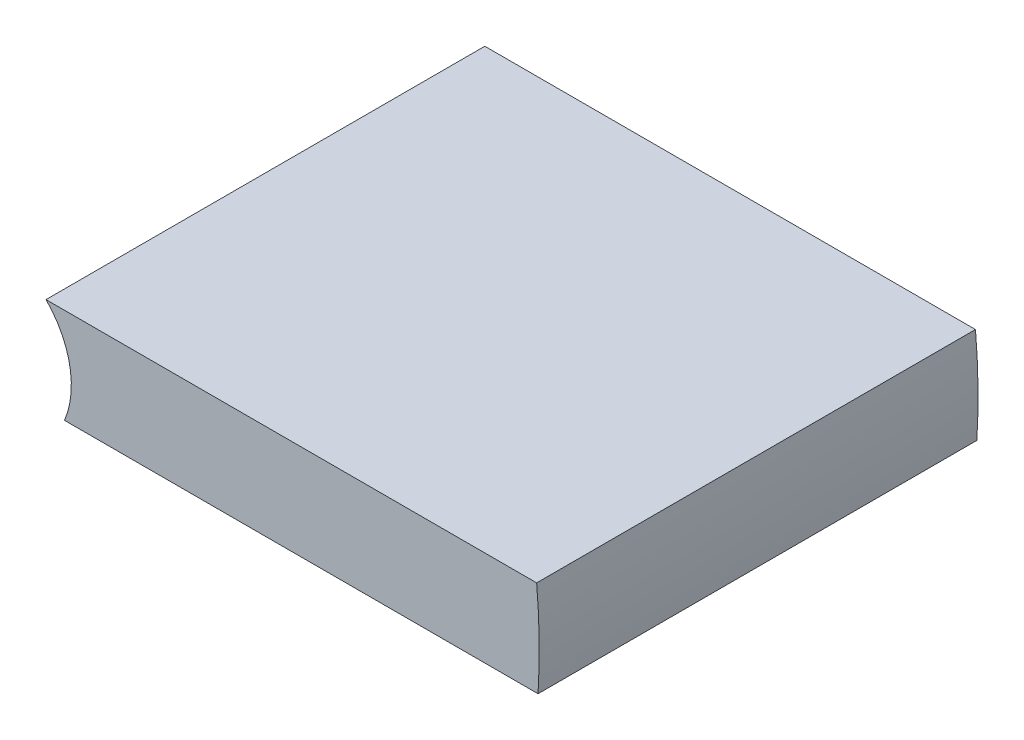
ISO-10303-21;
HEADER;
FILE_DESCRIPTION(('STEP AP214'),'2;1');
FILE_NAME('part.step','',(''),(''),'','','');
FILE_SCHEMA(('AUTOMOTIVE_DESIGN { 1 0 10303 214 1 1 1 1 }'));
ENDSEC;
DATA;
#1=APPLICATION_CONTEXT('core data for automotive mechanical design processes');
#2=APPLICATION_PROTOCOL_DEFINITION('international standard','automotive_design',2000,#1);
#3=PRODUCT_CONTEXT('',#1,'mechanical');
#4=PRODUCT('Part','Part','',(#3));
#5=PRODUCT_RELATED_PRODUCT_CATEGORY('part','',(#4));
#6=PRODUCT_DEFINITION_FORMATION('','',#4);
#7=PRODUCT_DEFINITION_CONTEXT('part definition',#1,'design');
#8=PRODUCT_DEFINITION('design','',#6,#7);
#9=PRODUCT_DEFINITION_SHAPE('','',#8);
#10=(LENGTH_UNIT() NAMED_UNIT(*) SI_UNIT(.MILLI.,.METRE.));
#11=(NAMED_UNIT(*) PLANE_ANGLE_UNIT() SI_UNIT($,.RADIAN.));
#12=(NAMED_UNIT(*) SI_UNIT($,.STERADIAN.) SOLID_ANGLE_UNIT());
#13=UNCERTAINTY_MEASURE_WITH_UNIT(LENGTH_MEASURE(1.E-05),#10,'distance_accuracy_value','');
#14=(GEOMETRIC_REPRESENTATION_CONTEXT(3) GLOBAL_UNCERTAINTY_ASSIGNED_CONTEXT((#13)) GLOBAL_UNIT_ASSIGNED_CONTEXT((#10,
#11,#12)) REPRESENTATION_CONTEXT('',''));
#15=CARTESIAN_POINT('',(0.,0.,0.));
#16=DIRECTION('',(0.,0.,1.));
#17=DIRECTION('',(1.,0.,0.));
#18=AXIS2_PLACEMENT_3D('',#15,#16,#17);
#19=CARTESIAN_POINT('',(-26.838760808324,6.002896226117,0.));
#20=DIRECTION('',(0.,-1.,0.));
#21=DIRECTION('',(1.,0.,0.));
#22=AXIS2_PLACEMENT_3D('',#19,#20,#21);
#23=PLANE('',#22);
#24=DIRECTION('',(1.,0.,0.));
#25=VECTOR('',#24,1.);
#26=CARTESIAN_POINT('',(-26.838760808324,6.002896226117,0.));
#27=LINE('',#26,#25);
#28=CARTESIAN_POINT('',(-26.838760808324,6.002896226117,0.));
#29=VERTEX_POINT('',#28);
#30=CARTESIAN_POINT('',(-26.730840261018,6.002896226117,0.));
#31=VERTEX_POINT('',#30);
#32=EDGE_CURVE('E11',#29,#31,#27,.T.);
#33=ORIENTED_EDGE('',*,*,#32,.T.);
#34=DIRECTION('',(0.,0.,1.));
#35=VECTOR('',#34,1.);
#36=CARTESIAN_POINT('',(-26.730840261018,6.002896226117,0.));
#37=LINE('',#36,#35);
#38=CARTESIAN_POINT('',(-26.730840261018,6.002896226117,0.1));
#39=VERTEX_POINT('',#38);
#40=EDGE_CURVE('E24',#31,#39,#37,.T.);
#41=ORIENTED_EDGE('',*,*,#40,.T.);
#42=DIRECTION('',(1.,0.,0.));
#43=VECTOR('',#42,1.);
#44=CARTESIAN_POINT('',(-26.838760808324,6.002896226117,0.1));
#45=LINE('',#44,#43);
#46=CARTESIAN_POINT('',(-26.838760808324,6.002896226117,0.1));
#47=VERTEX_POINT('',#46);
#48=EDGE_CURVE('E75',#47,#39,#45,.T.);
#49=ORIENTED_EDGE('',*,*,#48,.F.);
#50=DIRECTION('',(0.,0.,1.));
#51=VECTOR('',#50,1.);
#52=CARTESIAN_POINT('',(-26.838760808324,6.002896226117,0.));
#53=LINE('',#52,#51);
#54=EDGE_CURVE('E86',#29,#47,#53,.T.);
#55=ORIENTED_EDGE('',*,*,#54,.F.);
#56=EDGE_LOOP('',(#33,#41,#49,#55));
#57=FACE_BOUND('',#56,.T.);
#58=ADVANCED_FACE('F17',(#57),#23,.T.);
#59=CARTESIAN_POINT('',(-26.857062475982,6.010624532242,0.));
#60=DIRECTION('',(0.,0.,1.));
#61=DIRECTION('',(-0.921232689502346,0.389011994406694,0.));
#62=AXIS2_PLACEMENT_3D('',#59,#60,#61);
#63=CYLINDRICAL_SURFACE('',#62,0.0198664982977377);
#64=CARTESIAN_POINT('',(-26.857062475982,6.010624532242,0.));
#65=DIRECTION('',(0.,0.,-1.));
#66=DIRECTION('',(-0.921232689502346,0.389011994406694,0.));
#67=AXIS2_PLACEMENT_3D('',#64,#65,#66);
#68=CIRCLE('',#67,0.0198664982977377);
#69=CARTESIAN_POINT('',(-26.842967991419,6.024625362914,0.));
#70=VERTEX_POINT('',#69);
#71=EDGE_CURVE('E83',#70,#29,#68,.T.);
#72=ORIENTED_EDGE('',*,*,#71,.T.);
#73=ORIENTED_EDGE('',*,*,#54,.T.);
#74=CARTESIAN_POINT('',(-26.857062475982,6.010624532242,0.1));
#75=DIRECTION('',(0.,0.,-1.));
#76=DIRECTION('',(-0.921232689502346,0.389011994406694,0.));
#77=AXIS2_PLACEMENT_3D('',#74,#75,#76);
#78=CIRCLE('',#77,0.0198664982977377);
#79=CARTESIAN_POINT('',(-26.842967991419,6.024625362914,0.1));
#80=VERTEX_POINT('',#79);
#81=EDGE_CURVE('E81',#80,#47,#78,.T.);
#82=ORIENTED_EDGE('',*,*,#81,.F.);
#83=DIRECTION('',(0.,0.,1.));
#84=VECTOR('',#83,1.);
#85=CARTESIAN_POINT('',(-26.842967991419,6.024625362914,0.));
#86=LINE('',#85,#84);
#87=EDGE_CURVE('E60',#70,#80,#86,.T.);
#88=ORIENTED_EDGE('',*,*,#87,.F.);
#89=EDGE_LOOP('',(#72,#73,#82,#88));
#90=FACE_BOUND('',#89,.T.);
#91=ADVANCED_FACE('F91',(#90),#63,.F.);
#92=CARTESIAN_POINT('',(-26.731158279185,6.024625362914,0.));
#93=DIRECTION('',(0.,1.,0.));
#94=DIRECTION('',(-1.,0.,0.));
#95=AXIS2_PLACEMENT_3D('',#92,#93,#94);
#96=PLANE('',#95);
#97=DIRECTION('',(-1.,0.,0.));
#98=VECTOR('',#97,1.);
#99=CARTESIAN_POINT('',(-26.731158279185,6.024625362914,0.));
#100=LINE('',#99,#98);
#101=CARTESIAN_POINT('',(-26.731158279185,6.024625362914,0.));
#102=VERTEX_POINT('',#101);
#103=EDGE_CURVE('E65',#102,#70,#100,.T.);
#104=ORIENTED_EDGE('',*,*,#103,.T.);
#105=ORIENTED_EDGE('',*,*,#87,.T.);
#106=DIRECTION('',(-1.,0.,0.));
#107=VECTOR('',#106,1.);
#108=CARTESIAN_POINT('',(-26.731158279185,6.024625362914,0.1));
#109=LINE('',#108,#107);
#110=CARTESIAN_POINT('',(-26.731158279185,6.024625362914,0.1));
#111=VERTEX_POINT('',#110);
#112=EDGE_CURVE('E54',#111,#80,#109,.T.);
#113=ORIENTED_EDGE('',*,*,#112,.F.);
#114=DIRECTION('',(0.,0.,1.));
#115=VECTOR('',#114,1.);
#116=CARTESIAN_POINT('',(-26.731158279185,6.024625362914,0.));
#117=LINE('',#116,#115);
#118=EDGE_CURVE('E58',#102,#111,#117,.T.);
#119=ORIENTED_EDGE('',*,*,#118,.F.);
#120=EDGE_LOOP('',(#104,#105,#113,#119));
#121=FACE_BOUND('',#120,.T.);
#122=ADVANCED_FACE('F57',(#121),#96,.T.);
#123=CARTESIAN_POINT('',(-26.871812170946,6.011699918327,0.));
#124=DIRECTION('',(0.,0.,1.));
#125=DIRECTION('',(0.998055685603234,-0.062328552326037,0.));
#126=AXIS2_PLACEMENT_3D('',#123,#124,#125);
#127=CYLINDRICAL_SURFACE('',#126,0.141246537604029);
#128=CARTESIAN_POINT('',(-26.871812170946,6.011699918327,0.));
#129=DIRECTION('',(0.,0.,1.));
#130=DIRECTION('',(0.998055685603234,-0.062328552326037,0.));
#131=AXIS2_PLACEMENT_3D('',#128,#129,#130);
#132=CIRCLE('',#131,0.141246537604029);
#133=EDGE_CURVE('E71',#31,#102,#132,.T.);
#134=ORIENTED_EDGE('',*,*,#133,.T.);
#135=ORIENTED_EDGE('',*,*,#118,.T.);
#136=CARTESIAN_POINT('',(-26.871812170946,6.011699918327,0.1));
#137=DIRECTION('',(0.,0.,1.));
#138=DIRECTION('',(0.998055685603234,-0.062328552326037,0.));
#139=AXIS2_PLACEMENT_3D('',#136,#137,#138);
#140=CIRCLE('',#139,0.141246537604029);
#141=EDGE_CURVE('E70',#39,#111,#140,.T.);
#142=ORIENTED_EDGE('',*,*,#141,.F.);
#143=ORIENTED_EDGE('',*,*,#40,.F.);
#144=EDGE_LOOP('',(#134,#135,#142,#143));
#145=FACE_BOUND('',#144,.T.);
#146=ADVANCED_FACE('F69',(#145),#127,.T.);
#147=CARTESIAN_POINT('',(-26.786058807727,6.013957088039,0.1));
#148=DIRECTION('',(0.,0.,1.));
#149=DIRECTION('',(1.,0.,0.));
#150=AXIS2_PLACEMENT_3D('',#147,#148,#149);
#151=PLANE('',#150);
#152=ORIENTED_EDGE('',*,*,#141,.T.);
#153=ORIENTED_EDGE('',*,*,#112,.T.);
#154=ORIENTED_EDGE('',*,*,#81,.T.);
#155=ORIENTED_EDGE('',*,*,#48,.T.);
#156=EDGE_LOOP('',(#152,#153,#154,#155));
#157=FACE_BOUND('',#156,.T.);
#158=ADVANCED_FACE('F74',(#157),#151,.T.);
#159=CARTESIAN_POINT('',(-26.786058807727,6.013957088039,0.));
#160=DIRECTION('',(0.,0.,1.));
#161=DIRECTION('',(1.,0.,0.));
#162=AXIS2_PLACEMENT_3D('',#159,#160,#161);
#163=PLANE('',#162);
#164=ORIENTED_EDGE('',*,*,#133,.F.);
#165=ORIENTED_EDGE('',*,*,#32,.F.);
#166=ORIENTED_EDGE('',*,*,#71,.F.);
#167=ORIENTED_EDGE('',*,*,#103,.F.);
#168=EDGE_LOOP('',(#164,#165,#166,#167));
#169=FACE_BOUND('',#168,.T.);
#170=ADVANCED_FACE('F89',(#169),#163,.F.);
#171=CLOSED_SHELL('',(#58,#91,#122,#146,#158,#170));
#172=MANIFOLD_SOLID_BREP('B1',#171);
#173=ADVANCED_BREP_SHAPE_REPRESENTATION('',(#18,#172),#14);
#174=SHAPE_DEFINITION_REPRESENTATION(#9,#173);
ENDSEC;
END-ISO-10303-21;
